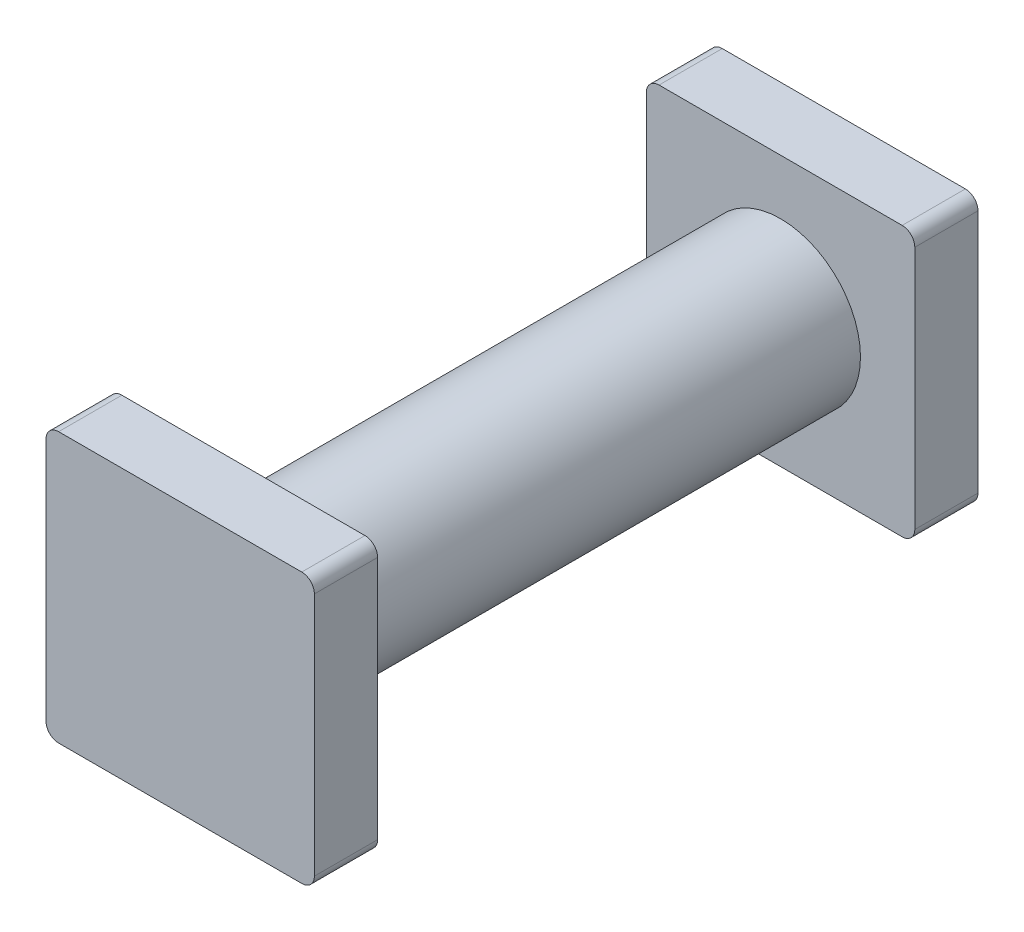
ISO-10303-21;
HEADER;
FILE_DESCRIPTION(('STEP AP214'),'2;1');
FILE_NAME('part.step','',(''),(''),'','','');
FILE_SCHEMA(('AUTOMOTIVE_DESIGN { 1 0 10303 214 1 1 1 1 }'));
ENDSEC;
DATA;
#1=APPLICATION_CONTEXT('core data for automotive mechanical design processes');
#2=APPLICATION_PROTOCOL_DEFINITION('international standard','automotive_design',2000,#1);
#3=PRODUCT_CONTEXT('',#1,'mechanical');
#4=PRODUCT('Part','Part','',(#3));
#5=PRODUCT_RELATED_PRODUCT_CATEGORY('part','',(#4));
#6=PRODUCT_DEFINITION_FORMATION('','',#4);
#7=PRODUCT_DEFINITION_CONTEXT('part definition',#1,'design');
#8=PRODUCT_DEFINITION('design','',#6,#7);
#9=PRODUCT_DEFINITION_SHAPE('','',#8);
#10=(LENGTH_UNIT() NAMED_UNIT(*) SI_UNIT(.MILLI.,.METRE.));
#11=(NAMED_UNIT(*) PLANE_ANGLE_UNIT() SI_UNIT($,.RADIAN.));
#12=(NAMED_UNIT(*) SI_UNIT($,.STERADIAN.) SOLID_ANGLE_UNIT());
#13=UNCERTAINTY_MEASURE_WITH_UNIT(LENGTH_MEASURE(1.E-05),#10,'distance_accuracy_value','');
#14=(GEOMETRIC_REPRESENTATION_CONTEXT(3) GLOBAL_UNCERTAINTY_ASSIGNED_CONTEXT((#13)) GLOBAL_UNIT_ASSIGNED_CONTEXT((#10,
#11,#12)) REPRESENTATION_CONTEXT('',''));
#15=CARTESIAN_POINT('',(0.,0.,0.));
#16=DIRECTION('',(0.,0.,1.));
#17=DIRECTION('',(1.,0.,0.));
#18=AXIS2_PLACEMENT_3D('',#15,#16,#17);
#19=CARTESIAN_POINT('',(-73.3448387255003,-305.719222009714,10.));
#20=DIRECTION('',(-1.,0.,0.));
#21=DIRECTION('',(0.,0.,1.));
#22=AXIS2_PLACEMENT_3D('',#19,#20,#21);
#23=PLANE('',#22);
#24=DIRECTION('',(0.,1.,0.));
#25=VECTOR('',#24,1.);
#26=CARTESIAN_POINT('',(-73.3448387255003,-305.719222009714,0.));
#27=LINE('',#26,#25);
#28=CARTESIAN_POINT('',(-73.3448387255003,-303.719222009714,0.));
#29=VERTEX_POINT('',#28);
#30=CARTESIAN_POINT('',(-73.3448387255003,-265.044790430911,0.));
#31=VERTEX_POINT('',#30);
#32=EDGE_CURVE('E173',#29,#31,#27,.T.);
#33=ORIENTED_EDGE('',*,*,#32,.T.);
#34=DIRECTION('',(0.,0.,-1.));
#35=VECTOR('',#34,1.);
#36=CARTESIAN_POINT('',(-73.3448387255003,-265.044790430911,10.));
#37=LINE('',#36,#35);
#38=CARTESIAN_POINT('',(-73.3448387255003,-265.044790430911,10.));
#39=VERTEX_POINT('',#38);
#40=EDGE_CURVE('E151',#31,#39,#37,.F.);
#41=ORIENTED_EDGE('',*,*,#40,.T.);
#42=DIRECTION('',(0.,1.,0.));
#43=VECTOR('',#42,1.);
#44=CARTESIAN_POINT('',(-73.3448387255003,-305.719222009714,10.));
#45=LINE('',#44,#43);
#46=CARTESIAN_POINT('',(-73.3448387255003,-303.719222009714,10.));
#47=VERTEX_POINT('',#46);
#48=EDGE_CURVE('E184',#47,#39,#45,.T.);
#49=ORIENTED_EDGE('',*,*,#48,.F.);
#50=DIRECTION('',(0.,0.,-1.));
#51=VECTOR('',#50,1.);
#52=CARTESIAN_POINT('',(-73.3448387255003,-303.719222009714,10.));
#53=LINE('',#52,#51);
#54=EDGE_CURVE('E156',#47,#29,#53,.T.);
#55=ORIENTED_EDGE('',*,*,#54,.T.);
#56=EDGE_LOOP('',(#33,#41,#49,#55));
#57=FACE_BOUND('',#56,.T.);
#58=ADVANCED_FACE('F33',(#57),#23,.F.);
#59=CARTESIAN_POINT('',(-115.812057358488,-263.044790430911,10.));
#60=DIRECTION('',(0.,-1.,0.));
#61=DIRECTION('',(0.,0.,-1.));
#62=AXIS2_PLACEMENT_3D('',#59,#60,#61);
#63=PLANE('',#62);
#64=DIRECTION('',(-1.,0.,0.));
#65=VECTOR('',#64,1.);
#66=CARTESIAN_POINT('',(-115.812057358488,-263.044790430911,10.));
#67=LINE('',#66,#65);
#68=CARTESIAN_POINT('',(-75.3448387255003,-263.044790430911,10.));
#69=VERTEX_POINT('',#68);
#70=CARTESIAN_POINT('',(-113.812057358488,-263.044790430911,10.));
#71=VERTEX_POINT('',#70);
#72=EDGE_CURVE('E166',#69,#71,#67,.T.);
#73=ORIENTED_EDGE('',*,*,#72,.F.);
#74=DIRECTION('',(0.,0.,-1.));
#75=VECTOR('',#74,1.);
#76=CARTESIAN_POINT('',(-75.3448387255003,-263.044790430911,10.));
#77=LINE('',#76,#75);
#78=CARTESIAN_POINT('',(-75.3448387255003,-263.044790430911,0.));
#79=VERTEX_POINT('',#78);
#80=EDGE_CURVE('E150',#69,#79,#77,.T.);
#81=ORIENTED_EDGE('',*,*,#80,.T.);
#82=DIRECTION('',(-1.,0.,0.));
#83=VECTOR('',#82,1.);
#84=CARTESIAN_POINT('',(-115.812057358488,-263.044790430911,0.));
#85=LINE('',#84,#83);
#86=CARTESIAN_POINT('',(-113.812057358488,-263.044790430911,0.));
#87=VERTEX_POINT('',#86);
#88=EDGE_CURVE('E163',#79,#87,#85,.T.);
#89=ORIENTED_EDGE('',*,*,#88,.T.);
#90=DIRECTION('',(0.,0.,-1.));
#91=VECTOR('',#90,1.);
#92=CARTESIAN_POINT('',(-113.812057358488,-263.044790430911,10.));
#93=LINE('',#92,#91);
#94=EDGE_CURVE('E168',#87,#71,#93,.F.);
#95=ORIENTED_EDGE('',*,*,#94,.T.);
#96=EDGE_LOOP('',(#73,#81,#89,#95));
#97=FACE_BOUND('',#96,.T.);
#98=ADVANCED_FACE('F162',(#97),#63,.F.);
#99=CARTESIAN_POINT('',(-115.812057358488,-305.719222009714,10.));
#100=DIRECTION('',(1.,0.,0.));
#101=DIRECTION('',(0.,0.,-1.));
#102=AXIS2_PLACEMENT_3D('',#99,#100,#101);
#103=PLANE('',#102);
#104=DIRECTION('',(0.,-1.,0.));
#105=VECTOR('',#104,1.);
#106=CARTESIAN_POINT('',(-115.812057358488,-305.719222009714,0.));
#107=LINE('',#106,#105);
#108=CARTESIAN_POINT('',(-115.812057358488,-265.044790430911,0.));
#109=VERTEX_POINT('',#108);
#110=CARTESIAN_POINT('',(-115.812057358488,-303.719222009714,0.));
#111=VERTEX_POINT('',#110);
#112=EDGE_CURVE('E172',#109,#111,#107,.T.);
#113=ORIENTED_EDGE('',*,*,#112,.T.);
#114=DIRECTION('',(0.,0.,-1.));
#115=VECTOR('',#114,1.);
#116=CARTESIAN_POINT('',(-115.812057358488,-303.719222009714,10.));
#117=LINE('',#116,#115);
#118=CARTESIAN_POINT('',(-115.812057358488,-303.719222009714,10.));
#119=VERTEX_POINT('',#118);
#120=EDGE_CURVE('E243',#111,#119,#117,.F.);
#121=ORIENTED_EDGE('',*,*,#120,.T.);
#122=DIRECTION('',(0.,-1.,0.));
#123=VECTOR('',#122,1.);
#124=CARTESIAN_POINT('',(-115.812057358488,-305.719222009714,10.));
#125=LINE('',#124,#123);
#126=CARTESIAN_POINT('',(-115.812057358488,-265.044790430911,10.));
#127=VERTEX_POINT('',#126);
#128=EDGE_CURVE('E273',#127,#119,#125,.T.);
#129=ORIENTED_EDGE('',*,*,#128,.F.);
#130=DIRECTION('',(0.,0.,-1.));
#131=VECTOR('',#130,1.);
#132=CARTESIAN_POINT('',(-115.812057358488,-265.044790430911,10.));
#133=LINE('',#132,#131);
#134=EDGE_CURVE('E240',#127,#109,#133,.T.);
#135=ORIENTED_EDGE('',*,*,#134,.T.);
#136=EDGE_LOOP('',(#113,#121,#129,#135));
#137=FACE_BOUND('',#136,.T.);
#138=ADVANCED_FACE('F295',(#137),#103,.F.);
#139=CARTESIAN_POINT('',(-115.812057358488,-305.719222009714,10.));
#140=DIRECTION('',(0.,1.,0.));
#141=DIRECTION('',(0.,0.,1.));
#142=AXIS2_PLACEMENT_3D('',#139,#140,#141);
#143=PLANE('',#142);
#144=DIRECTION('',(1.,0.,0.));
#145=VECTOR('',#144,1.);
#146=CARTESIAN_POINT('',(-115.812057358488,-305.719222009714,0.));
#147=LINE('',#146,#145);
#148=CARTESIAN_POINT('',(-113.812057358488,-305.719222009714,0.));
#149=VERTEX_POINT('',#148);
#150=CARTESIAN_POINT('',(-75.3448387255003,-305.719222009714,0.));
#151=VERTEX_POINT('',#150);
#152=EDGE_CURVE('E176',#149,#151,#147,.T.);
#153=ORIENTED_EDGE('',*,*,#152,.T.);
#154=DIRECTION('',(0.,0.,-1.));
#155=VECTOR('',#154,1.);
#156=CARTESIAN_POINT('',(-75.3448387255003,-305.719222009714,10.));
#157=LINE('',#156,#155);
#158=CARTESIAN_POINT('',(-75.3448387255003,-305.719222009714,10.));
#159=VERTEX_POINT('',#158);
#160=EDGE_CURVE('E238',#151,#159,#157,.F.);
#161=ORIENTED_EDGE('',*,*,#160,.T.);
#162=DIRECTION('',(1.,0.,0.));
#163=VECTOR('',#162,1.);
#164=CARTESIAN_POINT('',(-115.812057358488,-305.719222009714,10.));
#165=LINE('',#164,#163);
#166=CARTESIAN_POINT('',(-113.812057358488,-305.719222009714,10.));
#167=VERTEX_POINT('',#166);
#168=EDGE_CURVE('E269',#167,#159,#165,.T.);
#169=ORIENTED_EDGE('',*,*,#168,.F.);
#170=DIRECTION('',(0.,0.,-1.));
#171=VECTOR('',#170,1.);
#172=CARTESIAN_POINT('',(-113.812057358488,-305.719222009714,10.));
#173=LINE('',#172,#171);
#174=EDGE_CURVE('E235',#167,#149,#173,.T.);
#175=ORIENTED_EDGE('',*,*,#174,.T.);
#176=EDGE_LOOP('',(#153,#161,#169,#175));
#177=FACE_BOUND('',#176,.T.);
#178=ADVANCED_FACE('F290',(#177),#143,.F.);
#179=CARTESIAN_POINT('',(0.,0.,10.));
#180=DIRECTION('',(0.,0.,-1.));
#181=DIRECTION('',(-1.,0.,0.));
#182=AXIS2_PLACEMENT_3D('',#179,#180,#181);
#183=PLANE('',#182);
#184=CARTESIAN_POINT('',(-94.5784480419939,-284.382006220312,10.));
#185=DIRECTION('',(0.,0.,1.));
#186=DIRECTION('',(1.,0.,0.));
#187=AXIS2_PLACEMENT_3D('',#184,#185,#186);
#188=CIRCLE('',#187,12.6373752821836);
#189=CARTESIAN_POINT('',(-81.9410727598103,-284.382006220312,10.));
#190=VERTEX_POINT('',#189);
#191=EDGE_CURVE('E188',#190,#190,#188,.T.);
#192=ORIENTED_EDGE('',*,*,#191,.F.);
#193=EDGE_LOOP('',(#192));
#194=FACE_BOUND('',#193,.T.);
#195=ORIENTED_EDGE('',*,*,#48,.T.);
#196=CARTESIAN_POINT('',(-75.3448387255003,-265.044790430911,10.));
#197=DIRECTION('',(0.,0.,-1.));
#198=DIRECTION('',(-1.,0.,0.));
#199=AXIS2_PLACEMENT_3D('',#196,#197,#198);
#200=CIRCLE('',#199,2.);
#201=EDGE_CURVE('E203',#39,#69,#200,.F.);
#202=ORIENTED_EDGE('',*,*,#201,.T.);
#203=ORIENTED_EDGE('',*,*,#72,.T.);
#204=CARTESIAN_POINT('',(-113.812057358488,-265.044790430911,10.));
#205=DIRECTION('',(0.,0.,-1.));
#206=DIRECTION('',(-1.,0.,0.));
#207=AXIS2_PLACEMENT_3D('',#204,#205,#206);
#208=CIRCLE('',#207,2.);
#209=EDGE_CURVE('E197',#71,#127,#208,.F.);
#210=ORIENTED_EDGE('',*,*,#209,.T.);
#211=ORIENTED_EDGE('',*,*,#128,.T.);
#212=CARTESIAN_POINT('',(-113.812057358488,-303.719222009714,10.));
#213=DIRECTION('',(0.,0.,-1.));
#214=DIRECTION('',(-1.,0.,0.));
#215=AXIS2_PLACEMENT_3D('',#212,#213,#214);
#216=CIRCLE('',#215,2.);
#217=EDGE_CURVE('E199',#119,#167,#216,.F.);
#218=ORIENTED_EDGE('',*,*,#217,.T.);
#219=ORIENTED_EDGE('',*,*,#168,.T.);
#220=CARTESIAN_POINT('',(-75.3448387255003,-303.719222009714,10.));
#221=DIRECTION('',(0.,0.,-1.));
#222=DIRECTION('',(-1.,0.,0.));
#223=AXIS2_PLACEMENT_3D('',#220,#221,#222);
#224=CIRCLE('',#223,2.);
#225=EDGE_CURVE('E201',#159,#47,#224,.F.);
#226=ORIENTED_EDGE('',*,*,#225,.T.);
#227=EDGE_LOOP('',(#195,#202,#203,#210,#211,#218,#219,#226));
#228=FACE_BOUND('',#227,.T.);
#229=ADVANCED_FACE('F279',(#194,#228),#183,.F.);
#230=CARTESIAN_POINT('',(0.,0.,0.));
#231=DIRECTION('',(0.,0.,-1.));
#232=DIRECTION('',(-1.,0.,0.));
#233=AXIS2_PLACEMENT_3D('',#230,#231,#232);
#234=PLANE('',#233);
#235=ORIENTED_EDGE('',*,*,#88,.F.);
#236=CARTESIAN_POINT('',(-75.3448387255003,-265.044790430911,0.));
#237=DIRECTION('',(0.,0.,-1.));
#238=DIRECTION('',(-1.,0.,0.));
#239=AXIS2_PLACEMENT_3D('',#236,#237,#238);
#240=CIRCLE('',#239,2.);
#241=EDGE_CURVE('E146',#79,#31,#240,.T.);
#242=ORIENTED_EDGE('',*,*,#241,.T.);
#243=ORIENTED_EDGE('',*,*,#32,.F.);
#244=CARTESIAN_POINT('',(-75.3448387255003,-303.719222009714,0.));
#245=DIRECTION('',(0.,0.,-1.));
#246=DIRECTION('',(-1.,0.,0.));
#247=AXIS2_PLACEMENT_3D('',#244,#245,#246);
#248=CIRCLE('',#247,2.);
#249=EDGE_CURVE('E157',#29,#151,#248,.T.);
#250=ORIENTED_EDGE('',*,*,#249,.T.);
#251=ORIENTED_EDGE('',*,*,#152,.F.);
#252=CARTESIAN_POINT('',(-113.812057358488,-303.719222009714,0.));
#253=DIRECTION('',(0.,0.,-1.));
#254=DIRECTION('',(-1.,0.,0.));
#255=AXIS2_PLACEMENT_3D('',#252,#253,#254);
#256=CIRCLE('',#255,2.);
#257=EDGE_CURVE('E191',#149,#111,#256,.T.);
#258=ORIENTED_EDGE('',*,*,#257,.T.);
#259=ORIENTED_EDGE('',*,*,#112,.F.);
#260=CARTESIAN_POINT('',(-113.812057358488,-265.044790430911,0.));
#261=DIRECTION('',(0.,0.,-1.));
#262=DIRECTION('',(-1.,0.,0.));
#263=AXIS2_PLACEMENT_3D('',#260,#261,#262);
#264=CIRCLE('',#263,2.);
#265=EDGE_CURVE('E167',#109,#87,#264,.T.);
#266=ORIENTED_EDGE('',*,*,#265,.T.);
#267=EDGE_LOOP('',(#235,#242,#243,#250,#251,#258,#259,#266));
#268=FACE_BOUND('',#267,.T.);
#269=ADVANCED_FACE('F170',(#268),#234,.T.);
#270=CARTESIAN_POINT('',(-94.5784480419939,-284.382006220312,99.));
#271=DIRECTION('',(0.,0.,-1.));
#272=DIRECTION('',(-1.,0.,0.));
#273=AXIS2_PLACEMENT_3D('',#270,#271,#272);
#274=CYLINDRICAL_SURFACE('',#273,12.6373752821836);
#275=CARTESIAN_POINT('',(-94.5784480419939,-284.382006220312,95.));
#276=DIRECTION('',(0.,0.,-1.));
#277=DIRECTION('',(-1.,0.,0.));
#278=AXIS2_PLACEMENT_3D('',#275,#276,#277);
#279=CIRCLE('',#278,12.6373752821836);
#280=CARTESIAN_POINT('',(-107.215823324178,-284.382006220312,95.));
#281=VERTEX_POINT('',#280);
#282=EDGE_CURVE('E178',#281,#281,#279,.T.);
#283=ORIENTED_EDGE('',*,*,#282,.T.);
#284=EDGE_LOOP('',(#283));
#285=FACE_BOUND('',#284,.T.);
#286=ORIENTED_EDGE('',*,*,#191,.T.);
#287=EDGE_LOOP('',(#286));
#288=FACE_BOUND('',#287,.T.);
#289=ADVANCED_FACE('F400',(#285,#288),#274,.T.);
#290=CARTESIAN_POINT('',(-73.3448387255003,-305.719222009714,95.));
#291=DIRECTION('',(-1.,0.,0.));
#292=DIRECTION('',(0.,0.,1.));
#293=AXIS2_PLACEMENT_3D('',#290,#291,#292);
#294=PLANE('',#293);
#295=DIRECTION('',(0.,-1.,0.));
#296=VECTOR('',#295,1.);
#297=CARTESIAN_POINT('',(-73.3448387255003,-305.719222009714,95.));
#298=LINE('',#297,#296);
#299=CARTESIAN_POINT('',(-73.3448387255003,-265.044790430911,95.));
#300=VERTEX_POINT('',#299);
#301=CARTESIAN_POINT('',(-73.3448387255003,-303.719222009714,95.));
#302=VERTEX_POINT('',#301);
#303=EDGE_CURVE('E261',#300,#302,#298,.T.);
#304=ORIENTED_EDGE('',*,*,#303,.F.);
#305=DIRECTION('',(0.,0.,1.));
#306=VECTOR('',#305,1.);
#307=CARTESIAN_POINT('',(-73.3448387255003,-265.044790430911,95.));
#308=LINE('',#307,#306);
#309=CARTESIAN_POINT('',(-73.3448387255003,-265.044790430911,105.));
#310=VERTEX_POINT('',#309);
#311=EDGE_CURVE('E207',#300,#310,#308,.T.);
#312=ORIENTED_EDGE('',*,*,#311,.T.);
#313=DIRECTION('',(0.,-1.,0.));
#314=VECTOR('',#313,1.);
#315=CARTESIAN_POINT('',(-73.3448387255003,-305.719222009714,105.));
#316=LINE('',#315,#314);
#317=CARTESIAN_POINT('',(-73.3448387255003,-303.719222009714,105.));
#318=VERTEX_POINT('',#317);
#319=EDGE_CURVE('E263',#310,#318,#316,.T.);
#320=ORIENTED_EDGE('',*,*,#319,.T.);
#321=DIRECTION('',(0.,0.,1.));
#322=VECTOR('',#321,1.);
#323=CARTESIAN_POINT('',(-73.3448387255003,-303.719222009714,95.));
#324=LINE('',#323,#322);
#325=EDGE_CURVE('E205',#318,#302,#324,.F.);
#326=ORIENTED_EDGE('',*,*,#325,.T.);
#327=EDGE_LOOP('',(#304,#312,#320,#326));
#328=FACE_BOUND('',#327,.T.);
#329=ADVANCED_FACE('F376',(#328),#294,.F.);
#330=CARTESIAN_POINT('',(-115.812057358488,-305.719222009714,95.));
#331=DIRECTION('',(0.,1.,0.));
#332=DIRECTION('',(0.,0.,1.));
#333=AXIS2_PLACEMENT_3D('',#330,#331,#332);
#334=PLANE('',#333);
#335=DIRECTION('',(-1.,0.,0.));
#336=VECTOR('',#335,1.);
#337=CARTESIAN_POINT('',(-115.812057358488,-305.719222009714,95.));
#338=LINE('',#337,#336);
#339=CARTESIAN_POINT('',(-75.3448387255003,-305.719222009714,95.));
#340=VERTEX_POINT('',#339);
#341=CARTESIAN_POINT('',(-113.812057358488,-305.719222009714,95.));
#342=VERTEX_POINT('',#341);
#343=EDGE_CURVE('E362',#340,#342,#338,.T.);
#344=ORIENTED_EDGE('',*,*,#343,.F.);
#345=DIRECTION('',(0.,0.,1.));
#346=VECTOR('',#345,1.);
#347=CARTESIAN_POINT('',(-75.3448387255003,-305.719222009714,95.));
#348=LINE('',#347,#346);
#349=CARTESIAN_POINT('',(-75.3448387255003,-305.719222009714,105.));
#350=VERTEX_POINT('',#349);
#351=EDGE_CURVE('E232',#340,#350,#348,.T.);
#352=ORIENTED_EDGE('',*,*,#351,.T.);
#353=DIRECTION('',(-1.,0.,0.));
#354=VECTOR('',#353,1.);
#355=CARTESIAN_POINT('',(-115.812057358488,-305.719222009714,105.));
#356=LINE('',#355,#354);
#357=CARTESIAN_POINT('',(-113.812057358488,-305.719222009714,105.));
#358=VERTEX_POINT('',#357);
#359=EDGE_CURVE('E258',#350,#358,#356,.T.);
#360=ORIENTED_EDGE('',*,*,#359,.T.);
#361=DIRECTION('',(0.,0.,1.));
#362=VECTOR('',#361,1.);
#363=CARTESIAN_POINT('',(-113.812057358488,-305.719222009714,95.));
#364=LINE('',#363,#362);
#365=EDGE_CURVE('E230',#358,#342,#364,.F.);
#366=ORIENTED_EDGE('',*,*,#365,.T.);
#367=EDGE_LOOP('',(#344,#352,#360,#366));
#368=FACE_BOUND('',#367,.T.);
#369=ADVANCED_FACE('F361',(#368),#334,.F.);
#370=CARTESIAN_POINT('',(-115.812057358488,-305.719222009714,95.));
#371=DIRECTION('',(1.,0.,0.));
#372=DIRECTION('',(0.,0.,-1.));
#373=AXIS2_PLACEMENT_3D('',#370,#371,#372);
#374=PLANE('',#373);
#375=DIRECTION('',(0.,1.,0.));
#376=VECTOR('',#375,1.);
#377=CARTESIAN_POINT('',(-115.812057358488,-305.719222009714,105.));
#378=LINE('',#377,#376);
#379=CARTESIAN_POINT('',(-115.812057358488,-303.719222009714,105.));
#380=VERTEX_POINT('',#379);
#381=CARTESIAN_POINT('',(-115.812057358488,-265.044790430911,105.));
#382=VERTEX_POINT('',#381);
#383=EDGE_CURVE('E248',#380,#382,#378,.T.);
#384=ORIENTED_EDGE('',*,*,#383,.T.);
#385=DIRECTION('',(0.,0.,1.));
#386=VECTOR('',#385,1.);
#387=CARTESIAN_POINT('',(-115.812057358488,-265.044790430911,95.));
#388=LINE('',#387,#386);
#389=CARTESIAN_POINT('',(-115.812057358488,-265.044790430911,95.));
#390=VERTEX_POINT('',#389);
#391=EDGE_CURVE('E11',#382,#390,#388,.F.);
#392=ORIENTED_EDGE('',*,*,#391,.T.);
#393=DIRECTION('',(0.,1.,0.));
#394=VECTOR('',#393,1.);
#395=CARTESIAN_POINT('',(-115.812057358488,-305.719222009714,95.));
#396=LINE('',#395,#394);
#397=CARTESIAN_POINT('',(-115.812057358488,-303.719222009714,95.));
#398=VERTEX_POINT('',#397);
#399=EDGE_CURVE('E249',#398,#390,#396,.T.);
#400=ORIENTED_EDGE('',*,*,#399,.F.);
#401=DIRECTION('',(0.,0.,1.));
#402=VECTOR('',#401,1.);
#403=CARTESIAN_POINT('',(-115.812057358488,-303.719222009714,95.));
#404=LINE('',#403,#402);
#405=EDGE_CURVE('E41',#398,#380,#404,.T.);
#406=ORIENTED_EDGE('',*,*,#405,.T.);
#407=EDGE_LOOP('',(#384,#392,#400,#406));
#408=FACE_BOUND('',#407,.T.);
#409=ADVANCED_FACE('F247',(#408),#374,.F.);
#410=CARTESIAN_POINT('',(-115.812057358488,-263.044790430911,95.));
#411=DIRECTION('',(0.,-1.,0.));
#412=DIRECTION('',(0.,0.,-1.));
#413=AXIS2_PLACEMENT_3D('',#410,#411,#412);
#414=PLANE('',#413);
#415=DIRECTION('',(1.,0.,0.));
#416=VECTOR('',#415,1.);
#417=CARTESIAN_POINT('',(-115.812057358488,-263.044790430911,105.));
#418=LINE('',#417,#416);
#419=CARTESIAN_POINT('',(-113.812057358488,-263.044790430911,105.));
#420=VERTEX_POINT('',#419);
#421=CARTESIAN_POINT('',(-75.3448387255003,-263.044790430911,105.));
#422=VERTEX_POINT('',#421);
#423=EDGE_CURVE('E257',#420,#422,#418,.T.);
#424=ORIENTED_EDGE('',*,*,#423,.T.);
#425=DIRECTION('',(0.,0.,1.));
#426=VECTOR('',#425,1.);
#427=CARTESIAN_POINT('',(-75.3448387255003,-263.044790430911,95.));
#428=LINE('',#427,#426);
#429=CARTESIAN_POINT('',(-75.3448387255003,-263.044790430911,95.));
#430=VERTEX_POINT('',#429);
#431=EDGE_CURVE('E221',#422,#430,#428,.F.);
#432=ORIENTED_EDGE('',*,*,#431,.T.);
#433=DIRECTION('',(1.,0.,0.));
#434=VECTOR('',#433,1.);
#435=CARTESIAN_POINT('',(-115.812057358488,-263.044790430911,95.));
#436=LINE('',#435,#434);
#437=CARTESIAN_POINT('',(-113.812057358488,-263.044790430911,95.));
#438=VERTEX_POINT('',#437);
#439=EDGE_CURVE('E187',#438,#430,#436,.T.);
#440=ORIENTED_EDGE('',*,*,#439,.F.);
#441=DIRECTION('',(0.,0.,1.));
#442=VECTOR('',#441,1.);
#443=CARTESIAN_POINT('',(-113.812057358488,-263.044790430911,95.));
#444=LINE('',#443,#442);
#445=EDGE_CURVE('E218',#438,#420,#444,.T.);
#446=ORIENTED_EDGE('',*,*,#445,.T.);
#447=EDGE_LOOP('',(#424,#432,#440,#446));
#448=FACE_BOUND('',#447,.T.);
#449=ADVANCED_FACE('F380',(#448),#414,.F.);
#450=CARTESIAN_POINT('',(0.,0.,95.));
#451=DIRECTION('',(0.,0.,-1.));
#452=DIRECTION('',(-1.,0.,0.));
#453=AXIS2_PLACEMENT_3D('',#450,#451,#452);
#454=PLANE('',#453);
#455=ORIENTED_EDGE('',*,*,#282,.F.);
#456=EDGE_LOOP('',(#455));
#457=FACE_BOUND('',#456,.T.);
#458=ORIENTED_EDGE('',*,*,#439,.T.);
#459=CARTESIAN_POINT('',(-75.3448387255003,-265.044790430911,95.));
#460=DIRECTION('',(0.,0.,-1.));
#461=DIRECTION('',(-1.,0.,0.));
#462=AXIS2_PLACEMENT_3D('',#459,#460,#461);
#463=CIRCLE('',#462,2.);
#464=EDGE_CURVE('E228',#430,#300,#463,.T.);
#465=ORIENTED_EDGE('',*,*,#464,.T.);
#466=ORIENTED_EDGE('',*,*,#303,.T.);
#467=CARTESIAN_POINT('',(-75.3448387255003,-303.719222009714,95.));
#468=DIRECTION('',(0.,0.,-1.));
#469=DIRECTION('',(-1.,0.,0.));
#470=AXIS2_PLACEMENT_3D('',#467,#468,#469);
#471=CIRCLE('',#470,2.);
#472=EDGE_CURVE('E226',#302,#340,#471,.T.);
#473=ORIENTED_EDGE('',*,*,#472,.T.);
#474=ORIENTED_EDGE('',*,*,#343,.T.);
#475=CARTESIAN_POINT('',(-113.812057358488,-303.719222009714,95.));
#476=DIRECTION('',(0.,0.,-1.));
#477=DIRECTION('',(-1.,0.,0.));
#478=AXIS2_PLACEMENT_3D('',#475,#476,#477);
#479=CIRCLE('',#478,2.);
#480=EDGE_CURVE('E53',#342,#398,#479,.T.);
#481=ORIENTED_EDGE('',*,*,#480,.T.);
#482=ORIENTED_EDGE('',*,*,#399,.T.);
#483=CARTESIAN_POINT('',(-113.812057358488,-265.044790430911,95.));
#484=DIRECTION('',(0.,0.,-1.));
#485=DIRECTION('',(-1.,0.,0.));
#486=AXIS2_PLACEMENT_3D('',#483,#484,#485);
#487=CIRCLE('',#486,2.);
#488=EDGE_CURVE('E224',#390,#438,#487,.T.);
#489=ORIENTED_EDGE('',*,*,#488,.T.);
#490=EDGE_LOOP('',(#458,#465,#466,#473,#474,#481,#482,#489));
#491=FACE_BOUND('',#490,.T.);
#492=ADVANCED_FACE('F365',(#457,#491),#454,.T.);
#493=CARTESIAN_POINT('',(0.,0.,105.));
#494=DIRECTION('',(0.,0.,-1.));
#495=DIRECTION('',(-1.,0.,0.));
#496=AXIS2_PLACEMENT_3D('',#493,#494,#495);
#497=PLANE('',#496);
#498=ORIENTED_EDGE('',*,*,#319,.F.);
#499=CARTESIAN_POINT('',(-75.3448387255003,-265.044790430911,105.));
#500=DIRECTION('',(0.,0.,-1.));
#501=DIRECTION('',(-1.,0.,0.));
#502=AXIS2_PLACEMENT_3D('',#499,#500,#501);
#503=CIRCLE('',#502,2.);
#504=EDGE_CURVE('E216',#310,#422,#503,.F.);
#505=ORIENTED_EDGE('',*,*,#504,.T.);
#506=ORIENTED_EDGE('',*,*,#423,.F.);
#507=CARTESIAN_POINT('',(-113.812057358488,-265.044790430911,105.));
#508=DIRECTION('',(0.,0.,-1.));
#509=DIRECTION('',(-1.,0.,0.));
#510=AXIS2_PLACEMENT_3D('',#507,#508,#509);
#511=CIRCLE('',#510,2.);
#512=EDGE_CURVE('E212',#420,#382,#511,.F.);
#513=ORIENTED_EDGE('',*,*,#512,.T.);
#514=ORIENTED_EDGE('',*,*,#383,.F.);
#515=CARTESIAN_POINT('',(-113.812057358488,-303.719222009714,105.));
#516=DIRECTION('',(0.,0.,-1.));
#517=DIRECTION('',(-1.,0.,0.));
#518=AXIS2_PLACEMENT_3D('',#515,#516,#517);
#519=CIRCLE('',#518,2.);
#520=EDGE_CURVE('E210',#380,#358,#519,.F.);
#521=ORIENTED_EDGE('',*,*,#520,.T.);
#522=ORIENTED_EDGE('',*,*,#359,.F.);
#523=CARTESIAN_POINT('',(-75.3448387255003,-303.719222009714,105.));
#524=DIRECTION('',(0.,0.,-1.));
#525=DIRECTION('',(-1.,0.,0.));
#526=AXIS2_PLACEMENT_3D('',#523,#524,#525);
#527=CIRCLE('',#526,2.);
#528=EDGE_CURVE('E214',#350,#318,#527,.F.);
#529=ORIENTED_EDGE('',*,*,#528,.T.);
#530=EDGE_LOOP('',(#498,#505,#506,#513,#514,#521,#522,#529));
#531=FACE_BOUND('',#530,.T.);
#532=ADVANCED_FACE('F253',(#531),#497,.F.);
#533=CARTESIAN_POINT('',(-75.3448387255003,-265.044790430911,10.));
#534=DIRECTION('',(0.,0.,-1.));
#535=DIRECTION('',(-1.,0.,0.));
#536=AXIS2_PLACEMENT_3D('',#533,#534,#535);
#537=CYLINDRICAL_SURFACE('',#536,2.);
#538=ORIENTED_EDGE('',*,*,#201,.F.);
#539=ORIENTED_EDGE('',*,*,#40,.F.);
#540=ORIENTED_EDGE('',*,*,#241,.F.);
#541=ORIENTED_EDGE('',*,*,#80,.F.);
#542=EDGE_LOOP('',(#538,#539,#540,#541));
#543=FACE_BOUND('',#542,.T.);
#544=ADVANCED_FACE('F149',(#543),#537,.T.);
#545=CARTESIAN_POINT('',(-75.3448387255003,-265.044790430911,95.));
#546=DIRECTION('',(0.,0.,1.));
#547=DIRECTION('',(1.,0.,0.));
#548=AXIS2_PLACEMENT_3D('',#545,#546,#547);
#549=CYLINDRICAL_SURFACE('',#548,2.);
#550=ORIENTED_EDGE('',*,*,#464,.F.);
#551=ORIENTED_EDGE('',*,*,#431,.F.);
#552=ORIENTED_EDGE('',*,*,#504,.F.);
#553=ORIENTED_EDGE('',*,*,#311,.F.);
#554=EDGE_LOOP('',(#550,#551,#552,#553));
#555=FACE_BOUND('',#554,.T.);
#556=ADVANCED_FACE('F320',(#555),#549,.T.);
#557=CARTESIAN_POINT('',(-75.3448387255003,-303.719222009714,95.));
#558=DIRECTION('',(0.,0.,1.));
#559=DIRECTION('',(1.,0.,0.));
#560=AXIS2_PLACEMENT_3D('',#557,#558,#559);
#561=CYLINDRICAL_SURFACE('',#560,2.);
#562=ORIENTED_EDGE('',*,*,#472,.F.);
#563=ORIENTED_EDGE('',*,*,#325,.F.);
#564=ORIENTED_EDGE('',*,*,#528,.F.);
#565=ORIENTED_EDGE('',*,*,#351,.F.);
#566=EDGE_LOOP('',(#562,#563,#564,#565));
#567=FACE_BOUND('',#566,.T.);
#568=ADVANCED_FACE('F323',(#567),#561,.T.);
#569=CARTESIAN_POINT('',(-75.3448387255003,-303.719222009714,10.));
#570=DIRECTION('',(0.,0.,-1.));
#571=DIRECTION('',(-1.,0.,0.));
#572=AXIS2_PLACEMENT_3D('',#569,#570,#571);
#573=CYLINDRICAL_SURFACE('',#572,2.);
#574=ORIENTED_EDGE('',*,*,#225,.F.);
#575=ORIENTED_EDGE('',*,*,#160,.F.);
#576=ORIENTED_EDGE('',*,*,#249,.F.);
#577=ORIENTED_EDGE('',*,*,#54,.F.);
#578=EDGE_LOOP('',(#574,#575,#576,#577));
#579=FACE_BOUND('',#578,.T.);
#580=ADVANCED_FACE('F287',(#579),#573,.T.);
#581=CARTESIAN_POINT('',(-113.812057358488,-303.719222009714,10.));
#582=DIRECTION('',(0.,0.,-1.));
#583=DIRECTION('',(-1.,0.,0.));
#584=AXIS2_PLACEMENT_3D('',#581,#582,#583);
#585=CYLINDRICAL_SURFACE('',#584,2.);
#586=ORIENTED_EDGE('',*,*,#217,.F.);
#587=ORIENTED_EDGE('',*,*,#120,.F.);
#588=ORIENTED_EDGE('',*,*,#257,.F.);
#589=ORIENTED_EDGE('',*,*,#174,.F.);
#590=EDGE_LOOP('',(#586,#587,#588,#589));
#591=FACE_BOUND('',#590,.T.);
#592=ADVANCED_FACE('F292',(#591),#585,.T.);
#593=CARTESIAN_POINT('',(-113.812057358488,-265.044790430911,10.));
#594=DIRECTION('',(0.,0.,-1.));
#595=DIRECTION('',(-1.,0.,0.));
#596=AXIS2_PLACEMENT_3D('',#593,#594,#595);
#597=CYLINDRICAL_SURFACE('',#596,2.);
#598=ORIENTED_EDGE('',*,*,#209,.F.);
#599=ORIENTED_EDGE('',*,*,#94,.F.);
#600=ORIENTED_EDGE('',*,*,#265,.F.);
#601=ORIENTED_EDGE('',*,*,#134,.F.);
#602=EDGE_LOOP('',(#598,#599,#600,#601));
#603=FACE_BOUND('',#602,.T.);
#604=ADVANCED_FACE('F300',(#603),#597,.T.);
#605=CARTESIAN_POINT('',(-113.812057358488,-265.044790430911,95.));
#606=DIRECTION('',(0.,0.,1.));
#607=DIRECTION('',(1.,0.,0.));
#608=AXIS2_PLACEMENT_3D('',#605,#606,#607);
#609=CYLINDRICAL_SURFACE('',#608,2.);
#610=ORIENTED_EDGE('',*,*,#488,.F.);
#611=ORIENTED_EDGE('',*,*,#391,.F.);
#612=ORIENTED_EDGE('',*,*,#512,.F.);
#613=ORIENTED_EDGE('',*,*,#445,.F.);
#614=EDGE_LOOP('',(#610,#611,#612,#613));
#615=FACE_BOUND('',#614,.T.);
#616=ADVANCED_FACE('F302',(#615),#609,.T.);
#617=CARTESIAN_POINT('',(-113.812057358488,-303.719222009714,95.));
#618=DIRECTION('',(0.,0.,1.));
#619=DIRECTION('',(1.,0.,0.));
#620=AXIS2_PLACEMENT_3D('',#617,#618,#619);
#621=CYLINDRICAL_SURFACE('',#620,2.);
#622=ORIENTED_EDGE('',*,*,#480,.F.);
#623=ORIENTED_EDGE('',*,*,#365,.F.);
#624=ORIENTED_EDGE('',*,*,#520,.F.);
#625=ORIENTED_EDGE('',*,*,#405,.F.);
#626=EDGE_LOOP('',(#622,#623,#624,#625));
#627=FACE_BOUND('',#626,.T.);
#628=ADVANCED_FACE('F35',(#627),#621,.T.);
#629=CLOSED_SHELL('',(#58,#98,#138,#178,#229,#269,#289,#329,#369,#409,#449,#492,#532,#544,#556,
#568,#580,#592,#604,#616,#628));
#630=MANIFOLD_SOLID_BREP('B2',#629);
#631=ADVANCED_BREP_SHAPE_REPRESENTATION('',(#18,#630),#14);
#632=SHAPE_DEFINITION_REPRESENTATION(#9,#631);
ENDSEC;
END-ISO-10303-21;
